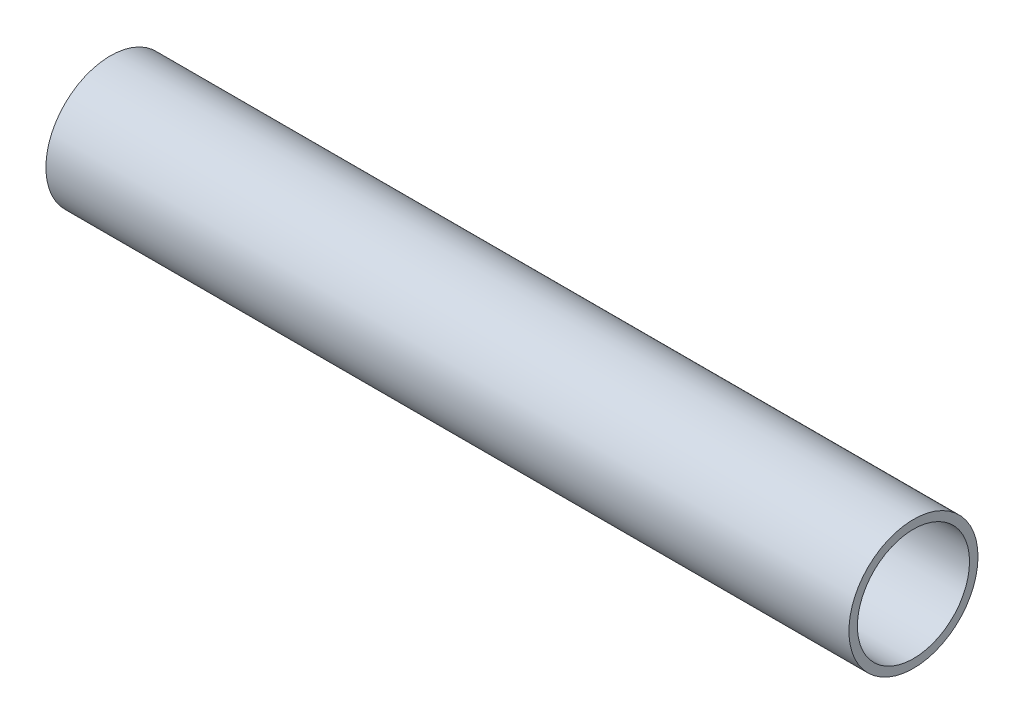
ISO-10303-21;
HEADER;
FILE_DESCRIPTION(('STEP AP214'),'2;1');
FILE_NAME('part.step','',(''),(''),'','','');
FILE_SCHEMA(('AUTOMOTIVE_DESIGN { 1 0 10303 214 1 1 1 1 }'));
ENDSEC;
DATA;
#1=APPLICATION_CONTEXT('core data for automotive mechanical design processes');
#2=APPLICATION_PROTOCOL_DEFINITION('international standard','automotive_design',2000,#1);
#3=PRODUCT_CONTEXT('',#1,'mechanical');
#4=PRODUCT('Part','Part','',(#3));
#5=PRODUCT_RELATED_PRODUCT_CATEGORY('part','',(#4));
#6=PRODUCT_DEFINITION_FORMATION('','',#4);
#7=PRODUCT_DEFINITION_CONTEXT('part definition',#1,'design');
#8=PRODUCT_DEFINITION('design','',#6,#7);
#9=PRODUCT_DEFINITION_SHAPE('','',#8);
#10=(LENGTH_UNIT() NAMED_UNIT(*) SI_UNIT(.MILLI.,.METRE.));
#11=(NAMED_UNIT(*) PLANE_ANGLE_UNIT() SI_UNIT($,.RADIAN.));
#12=(NAMED_UNIT(*) SI_UNIT($,.STERADIAN.) SOLID_ANGLE_UNIT());
#13=UNCERTAINTY_MEASURE_WITH_UNIT(LENGTH_MEASURE(1.E-05),#10,'distance_accuracy_value','');
#14=(GEOMETRIC_REPRESENTATION_CONTEXT(3) GLOBAL_UNCERTAINTY_ASSIGNED_CONTEXT((#13)) GLOBAL_UNIT_ASSIGNED_CONTEXT((#10,
#11,#12)) REPRESENTATION_CONTEXT('',''));
#15=CARTESIAN_POINT('',(0.,0.,0.));
#16=DIRECTION('',(0.,0.,1.));
#17=DIRECTION('',(1.,0.,0.));
#18=AXIS2_PLACEMENT_3D('',#15,#16,#17);
#19=CARTESIAN_POINT('',(0.,0.,0.));
#20=DIRECTION('',(1.,0.,0.));
#21=DIRECTION('',(0.,0.,-1.));
#22=AXIS2_PLACEMENT_3D('',#19,#20,#21);
#23=CYLINDRICAL_SURFACE('',#22,9.25);
#24=CARTESIAN_POINT('',(0.,0.,0.));
#25=DIRECTION('',(1.,0.,0.));
#26=DIRECTION('',(0.,0.,-1.));
#27=AXIS2_PLACEMENT_3D('',#24,#25,#26);
#28=CIRCLE('',#27,9.25);
#29=CARTESIAN_POINT('',(0.,0.,-9.25));
#30=VERTEX_POINT('',#29);
#31=EDGE_CURVE('E27',#30,#30,#28,.T.);
#32=ORIENTED_EDGE('',*,*,#31,.F.);
#33=EDGE_LOOP('',(#32));
#34=FACE_BOUND('',#33,.T.);
#35=CARTESIAN_POINT('',(132.5,0.,0.));
#36=DIRECTION('',(1.,0.,0.));
#37=DIRECTION('',(0.,0.,-1.));
#38=AXIS2_PLACEMENT_3D('',#35,#36,#37);
#39=CIRCLE('',#38,9.25);
#40=CARTESIAN_POINT('',(132.5,0.,-9.25));
#41=VERTEX_POINT('',#40);
#42=EDGE_CURVE('E18',#41,#41,#39,.T.);
#43=ORIENTED_EDGE('',*,*,#42,.T.);
#44=EDGE_LOOP('',(#43));
#45=FACE_BOUND('',#44,.T.);
#46=ADVANCED_FACE('F15',(#34,#45),#23,.F.);
#47=CARTESIAN_POINT('',(132.5,0.,0.));
#48=DIRECTION('',(-1.,0.,0.));
#49=DIRECTION('',(0.,0.,1.));
#50=AXIS2_PLACEMENT_3D('',#47,#48,#49);
#51=PLANE('',#50);
#52=ORIENTED_EDGE('',*,*,#42,.F.);
#53=EDGE_LOOP('',(#52));
#54=FACE_BOUND('',#53,.T.);
#55=CARTESIAN_POINT('',(132.5,0.,0.));
#56=DIRECTION('',(1.,0.,0.));
#57=DIRECTION('',(0.,0.,-1.));
#58=AXIS2_PLACEMENT_3D('',#55,#56,#57);
#59=CIRCLE('',#58,10.65);
#60=CARTESIAN_POINT('',(132.5,0.,-10.65));
#61=VERTEX_POINT('',#60);
#62=EDGE_CURVE('E22',#61,#61,#59,.F.);
#63=ORIENTED_EDGE('',*,*,#62,.F.);
#64=EDGE_LOOP('',(#63));
#65=FACE_BOUND('',#64,.T.);
#66=ADVANCED_FACE('F36',(#54,#65),#51,.F.);
#67=CARTESIAN_POINT('',(0.,0.,0.));
#68=DIRECTION('',(-1.,0.,0.));
#69=DIRECTION('',(0.,0.,1.));
#70=AXIS2_PLACEMENT_3D('',#67,#68,#69);
#71=PLANE('',#70);
#72=ORIENTED_EDGE('',*,*,#31,.T.);
#73=EDGE_LOOP('',(#72));
#74=FACE_BOUND('',#73,.T.);
#75=CARTESIAN_POINT('',(0.,0.,0.));
#76=DIRECTION('',(1.,0.,0.));
#77=DIRECTION('',(0.,0.,-1.));
#78=AXIS2_PLACEMENT_3D('',#75,#76,#77);
#79=CIRCLE('',#78,10.65);
#80=CARTESIAN_POINT('',(0.,0.,-10.65));
#81=VERTEX_POINT('',#80);
#82=EDGE_CURVE('E10',#81,#81,#79,.T.);
#83=ORIENTED_EDGE('',*,*,#82,.F.);
#84=EDGE_LOOP('',(#83));
#85=FACE_BOUND('',#84,.T.);
#86=ADVANCED_FACE('F39',(#74,#85),#71,.T.);
#87=CARTESIAN_POINT('',(0.,0.,0.));
#88=DIRECTION('',(1.,0.,0.));
#89=DIRECTION('',(0.,0.,-1.));
#90=AXIS2_PLACEMENT_3D('',#87,#88,#89);
#91=CYLINDRICAL_SURFACE('',#90,10.65);
#92=ORIENTED_EDGE('',*,*,#82,.T.);
#93=EDGE_LOOP('',(#92));
#94=FACE_BOUND('',#93,.T.);
#95=ORIENTED_EDGE('',*,*,#62,.T.);
#96=EDGE_LOOP('',(#95));
#97=FACE_BOUND('',#96,.T.);
#98=ADVANCED_FACE('F42',(#94,#97),#91,.T.);
#99=CLOSED_SHELL('',(#46,#66,#86,#98));
#100=MANIFOLD_SOLID_BREP('B1',#99);
#101=ADVANCED_BREP_SHAPE_REPRESENTATION('',(#18,#100),#14);
#102=SHAPE_DEFINITION_REPRESENTATION(#9,#101);
ENDSEC;
END-ISO-10303-21;
